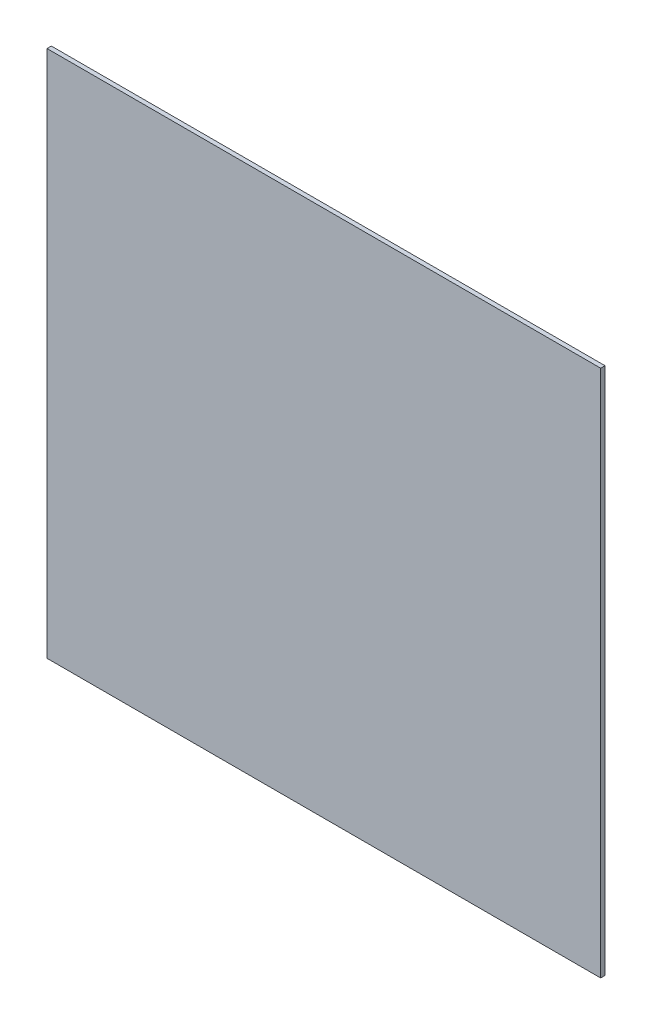
ISO-10303-21;
HEADER;
FILE_DESCRIPTION(('STEP AP214'),'2;1');
FILE_NAME('part.step','',(''),(''),'','','');
FILE_SCHEMA(('AUTOMOTIVE_DESIGN { 1 0 10303 214 1 1 1 1 }'));
ENDSEC;
DATA;
#1=APPLICATION_CONTEXT('core data for automotive mechanical design processes');
#2=APPLICATION_PROTOCOL_DEFINITION('international standard','automotive_design',2000,#1);
#3=PRODUCT_CONTEXT('',#1,'mechanical');
#4=PRODUCT('Part','Part','',(#3));
#5=PRODUCT_RELATED_PRODUCT_CATEGORY('part','',(#4));
#6=PRODUCT_DEFINITION_FORMATION('','',#4);
#7=PRODUCT_DEFINITION_CONTEXT('part definition',#1,'design');
#8=PRODUCT_DEFINITION('design','',#6,#7);
#9=PRODUCT_DEFINITION_SHAPE('','',#8);
#10=(LENGTH_UNIT() NAMED_UNIT(*) SI_UNIT(.MILLI.,.METRE.));
#11=(NAMED_UNIT(*) PLANE_ANGLE_UNIT() SI_UNIT($,.RADIAN.));
#12=(NAMED_UNIT(*) SI_UNIT($,.STERADIAN.) SOLID_ANGLE_UNIT());
#13=UNCERTAINTY_MEASURE_WITH_UNIT(LENGTH_MEASURE(1.E-05),#10,'distance_accuracy_value','');
#14=(GEOMETRIC_REPRESENTATION_CONTEXT(3) GLOBAL_UNCERTAINTY_ASSIGNED_CONTEXT((#13)) GLOBAL_UNIT_ASSIGNED_CONTEXT((#10,
#11,#12)) REPRESENTATION_CONTEXT('',''));
#15=CARTESIAN_POINT('',(0.,0.,0.));
#16=DIRECTION('',(0.,0.,1.));
#17=DIRECTION('',(1.,0.,0.));
#18=AXIS2_PLACEMENT_3D('',#15,#16,#17);
#19=CARTESIAN_POINT('',(203.2,0.,1.5875));
#20=DIRECTION('',(-1.,0.,0.));
#21=DIRECTION('',(0.,1.,0.));
#22=AXIS2_PLACEMENT_3D('',#19,#20,#21);
#23=PLANE('',#22);
#24=DIRECTION('',(0.,0.,1.));
#25=VECTOR('',#24,1.);
#26=CARTESIAN_POINT('',(203.2,0.,1.5875));
#27=LINE('',#26,#25);
#28=CARTESIAN_POINT('',(203.2,0.,0.));
#29=VERTEX_POINT('',#28);
#30=CARTESIAN_POINT('',(203.2,0.,1.5875));
#31=VERTEX_POINT('',#30);
#32=EDGE_CURVE('E11',#29,#31,#27,.T.);
#33=ORIENTED_EDGE('',*,*,#32,.F.);
#34=DIRECTION('',(0.,1.,0.));
#35=VECTOR('',#34,1.);
#36=CARTESIAN_POINT('',(203.2,0.,0.));
#37=LINE('',#36,#35);
#38=CARTESIAN_POINT('',(203.2,193.802,0.));
#39=VERTEX_POINT('',#38);
#40=EDGE_CURVE('E103',#29,#39,#37,.T.);
#41=ORIENTED_EDGE('',*,*,#40,.T.);
#42=DIRECTION('',(0.,0.,1.));
#43=VECTOR('',#42,1.);
#44=CARTESIAN_POINT('',(203.2,193.802,1.5875));
#45=LINE('',#44,#43);
#46=CARTESIAN_POINT('',(203.2,193.802,1.5875));
#47=VERTEX_POINT('',#46);
#48=EDGE_CURVE('E58',#39,#47,#45,.T.);
#49=ORIENTED_EDGE('',*,*,#48,.T.);
#50=DIRECTION('',(0.,1.,0.));
#51=VECTOR('',#50,1.);
#52=CARTESIAN_POINT('',(203.2,0.,1.5875));
#53=LINE('',#52,#51);
#54=EDGE_CURVE('E122',#31,#47,#53,.T.);
#55=ORIENTED_EDGE('',*,*,#54,.F.);
#56=EDGE_LOOP('',(#33,#41,#49,#55));
#57=FACE_BOUND('',#56,.T.);
#58=ADVANCED_FACE('F47',(#57),#23,.F.);
#59=CARTESIAN_POINT('',(0.,193.802,1.5875));
#60=DIRECTION('',(0.,-1.,0.));
#61=DIRECTION('',(-1.,0.,0.));
#62=AXIS2_PLACEMENT_3D('',#59,#60,#61);
#63=PLANE('',#62);
#64=ORIENTED_EDGE('',*,*,#48,.F.);
#65=DIRECTION('',(-1.,0.,0.));
#66=VECTOR('',#65,1.);
#67=CARTESIAN_POINT('',(0.,193.802,0.));
#68=LINE('',#67,#66);
#69=CARTESIAN_POINT('',(0.,193.802,0.));
#70=VERTEX_POINT('',#69);
#71=EDGE_CURVE('E112',#39,#70,#68,.T.);
#72=ORIENTED_EDGE('',*,*,#71,.T.);
#73=DIRECTION('',(0.,0.,1.));
#74=VECTOR('',#73,1.);
#75=CARTESIAN_POINT('',(0.,193.802,1.5875));
#76=LINE('',#75,#74);
#77=CARTESIAN_POINT('',(0.,193.802,1.5875));
#78=VERTEX_POINT('',#77);
#79=EDGE_CURVE('E66',#70,#78,#76,.T.);
#80=ORIENTED_EDGE('',*,*,#79,.T.);
#81=DIRECTION('',(-1.,0.,0.));
#82=VECTOR('',#81,1.);
#83=CARTESIAN_POINT('',(0.,193.802,1.5875));
#84=LINE('',#83,#82);
#85=EDGE_CURVE('E97',#47,#78,#84,.T.);
#86=ORIENTED_EDGE('',*,*,#85,.F.);
#87=EDGE_LOOP('',(#64,#72,#80,#86));
#88=FACE_BOUND('',#87,.T.);
#89=ADVANCED_FACE('F127',(#88),#63,.F.);
#90=CARTESIAN_POINT('',(0.,0.,1.5875));
#91=DIRECTION('',(1.,0.,0.));
#92=DIRECTION('',(0.,-1.,0.));
#93=AXIS2_PLACEMENT_3D('',#90,#91,#92);
#94=PLANE('',#93);
#95=ORIENTED_EDGE('',*,*,#79,.F.);
#96=DIRECTION('',(0.,1.,0.));
#97=VECTOR('',#96,1.);
#98=CARTESIAN_POINT('',(0.,0.,0.));
#99=LINE('',#98,#97);
#100=CARTESIAN_POINT('',(0.,0.,0.));
#101=VERTEX_POINT('',#100);
#102=EDGE_CURVE('E102',#70,#101,#99,.F.);
#103=ORIENTED_EDGE('',*,*,#102,.T.);
#104=DIRECTION('',(0.,0.,1.));
#105=VECTOR('',#104,1.);
#106=CARTESIAN_POINT('',(0.,0.,1.5875));
#107=LINE('',#106,#105);
#108=CARTESIAN_POINT('',(0.,0.,1.5875));
#109=VERTEX_POINT('',#108);
#110=EDGE_CURVE('E51',#101,#109,#107,.T.);
#111=ORIENTED_EDGE('',*,*,#110,.T.);
#112=DIRECTION('',(0.,-1.,0.));
#113=VECTOR('',#112,1.);
#114=CARTESIAN_POINT('',(0.,0.,1.5875));
#115=LINE('',#114,#113);
#116=EDGE_CURVE('E115',#78,#109,#115,.T.);
#117=ORIENTED_EDGE('',*,*,#116,.F.);
#118=EDGE_LOOP('',(#95,#103,#111,#117));
#119=FACE_BOUND('',#118,.T.);
#120=ADVANCED_FACE('F106',(#119),#94,.F.);
#121=CARTESIAN_POINT('',(0.,0.,1.5875));
#122=DIRECTION('',(0.,1.,0.));
#123=DIRECTION('',(1.,0.,0.));
#124=AXIS2_PLACEMENT_3D('',#121,#122,#123);
#125=PLANE('',#124);
#126=DIRECTION('',(-1.,0.,0.));
#127=VECTOR('',#126,1.);
#128=CARTESIAN_POINT('',(0.,0.,0.));
#129=LINE('',#128,#127);
#130=EDGE_CURVE('E90',#101,#29,#129,.F.);
#131=ORIENTED_EDGE('',*,*,#130,.T.);
#132=ORIENTED_EDGE('',*,*,#32,.T.);
#133=DIRECTION('',(1.,0.,0.));
#134=VECTOR('',#133,1.);
#135=CARTESIAN_POINT('',(0.,0.,1.5875));
#136=LINE('',#135,#134);
#137=EDGE_CURVE('E92',#109,#31,#136,.T.);
#138=ORIENTED_EDGE('',*,*,#137,.F.);
#139=ORIENTED_EDGE('',*,*,#110,.F.);
#140=EDGE_LOOP('',(#131,#132,#138,#139));
#141=FACE_BOUND('',#140,.T.);
#142=ADVANCED_FACE('F49',(#141),#125,.F.);
#143=CARTESIAN_POINT('',(0.,0.,1.5875));
#144=DIRECTION('',(0.,0.,-1.));
#145=DIRECTION('',(-1.,0.,0.));
#146=AXIS2_PLACEMENT_3D('',#143,#144,#145);
#147=PLANE('',#146);
#148=ORIENTED_EDGE('',*,*,#116,.T.);
#149=ORIENTED_EDGE('',*,*,#137,.T.);
#150=ORIENTED_EDGE('',*,*,#54,.T.);
#151=ORIENTED_EDGE('',*,*,#85,.T.);
#152=EDGE_LOOP('',(#148,#149,#150,#151));
#153=FACE_BOUND('',#152,.T.);
#154=ADVANCED_FACE('F125',(#153),#147,.F.);
#155=CARTESIAN_POINT('',(0.,0.,0.));
#156=DIRECTION('',(0.,0.,-1.));
#157=DIRECTION('',(-1.,0.,0.));
#158=AXIS2_PLACEMENT_3D('',#155,#156,#157);
#159=PLANE('',#158);
#160=ORIENTED_EDGE('',*,*,#102,.F.);
#161=ORIENTED_EDGE('',*,*,#71,.F.);
#162=ORIENTED_EDGE('',*,*,#40,.F.);
#163=ORIENTED_EDGE('',*,*,#130,.F.);
#164=EDGE_LOOP('',(#160,#161,#162,#163));
#165=FACE_BOUND('',#164,.T.);
#166=ADVANCED_FACE('F100',(#165),#159,.T.);
#167=CLOSED_SHELL('',(#58,#89,#120,#142,#154,#166));
#168=MANIFOLD_SOLID_BREP('B2',#167);
#169=ADVANCED_BREP_SHAPE_REPRESENTATION('',(#18,#168),#14);
#170=SHAPE_DEFINITION_REPRESENTATION(#9,#169);
ENDSEC;
END-ISO-10303-21;
